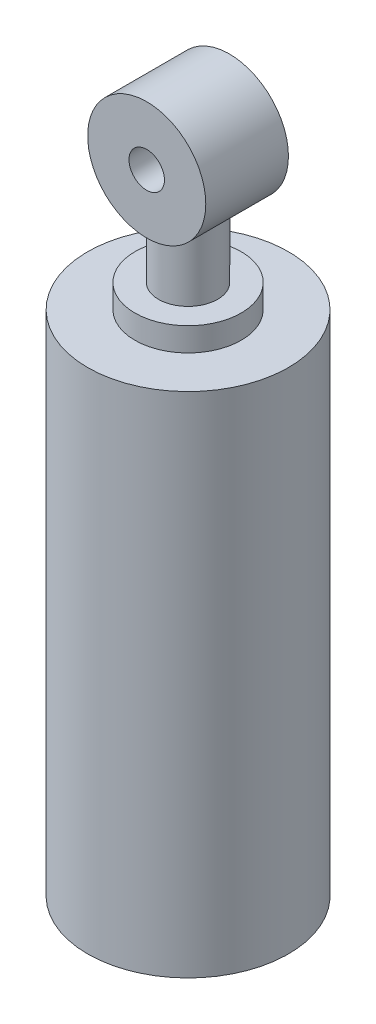
ISO-10303-21;
HEADER;
FILE_DESCRIPTION(('STEP AP214'),'2;1');
FILE_NAME('part.step','',(''),(''),'','','');
FILE_SCHEMA(('AUTOMOTIVE_DESIGN { 1 0 10303 214 1 1 1 1 }'));
ENDSEC;
DATA;
#1=APPLICATION_CONTEXT('core data for automotive mechanical design processes');
#2=APPLICATION_PROTOCOL_DEFINITION('international standard','automotive_design',2000,#1);
#3=PRODUCT_CONTEXT('',#1,'mechanical');
#4=PRODUCT('Part','Part','',(#3));
#5=PRODUCT_RELATED_PRODUCT_CATEGORY('part','',(#4));
#6=PRODUCT_DEFINITION_FORMATION('','',#4);
#7=PRODUCT_DEFINITION_CONTEXT('part definition',#1,'design');
#8=PRODUCT_DEFINITION('design','',#6,#7);
#9=PRODUCT_DEFINITION_SHAPE('','',#8);
#10=(LENGTH_UNIT() NAMED_UNIT(*) SI_UNIT(.MILLI.,.METRE.));
#11=(NAMED_UNIT(*) PLANE_ANGLE_UNIT() SI_UNIT($,.RADIAN.));
#12=(NAMED_UNIT(*) SI_UNIT($,.STERADIAN.) SOLID_ANGLE_UNIT());
#13=UNCERTAINTY_MEASURE_WITH_UNIT(LENGTH_MEASURE(1.E-05),#10,'distance_accuracy_value','');
#14=(GEOMETRIC_REPRESENTATION_CONTEXT(3) GLOBAL_UNCERTAINTY_ASSIGNED_CONTEXT((#13)) GLOBAL_UNIT_ASSIGNED_CONTEXT((#10,
#11,#12)) REPRESENTATION_CONTEXT('',''));
#15=CARTESIAN_POINT('',(0.,0.,0.));
#16=DIRECTION('',(0.,0.,1.));
#17=DIRECTION('',(1.,0.,0.));
#18=AXIS2_PLACEMENT_3D('',#15,#16,#17);
#19=CARTESIAN_POINT('',(0.,52.,0.));
#20=DIRECTION('',(0.,-1.,0.));
#21=DIRECTION('',(0.,0.,-1.));
#22=AXIS2_PLACEMENT_3D('',#19,#20,#21);
#23=CYLINDRICAL_SURFACE('',#22,2.5);
#24=CARTESIAN_POINT('',(0.,45.,0.));
#25=DIRECTION('',(0.,1.,0.));
#26=DIRECTION('',(0.,0.,1.));
#27=AXIS2_PLACEMENT_3D('',#24,#25,#26);
#28=CIRCLE('',#27,2.5);
#29=CARTESIAN_POINT('',(0.,45.,2.5));
#30=VERTEX_POINT('',#29);
#31=EDGE_CURVE('E92',#30,#30,#28,.T.);
#32=ORIENTED_EDGE('',*,*,#31,.T.);
#33=EDGE_LOOP('',(#32));
#34=FACE_BOUND('',#33,.T.);
#35=CARTESIAN_POINT('',(0.,50.,-2.5));
#36=CARTESIAN_POINT('',(-0.131426682334305,50.0000082244953,-2.49999033094399));
#37=CARTESIAN_POINT('',(-0.263015634437213,50.0052380086472,-2.48957443822597));
#38=CARTESIAN_POINT('',(-0.522301454622883,50.0256458143898,-2.44836817883795));
#39=CARTESIAN_POINT('',(-0.649990448564105,50.0408427281233,-2.41753911907498));
#40=CARTESIAN_POINT('',(-0.897333631316203,50.0795930907752,-2.33701537728116));
#41=CARTESIAN_POINT('',(-1.01701694536277,50.1031140409274,-2.28739401221727));
#42=CARTESIAN_POINT('',(-1.24618160399671,50.1563555667417,-2.1710734737482));
#43=CARTESIAN_POINT('',(-1.3556637520377,50.1860756535558,-2.10437564685491));
#44=CARTESIAN_POINT('',(-1.56876952630998,50.2510935494937,-1.95120686835737));
#45=CARTESIAN_POINT('',(-1.67163802294308,50.2866200234091,-1.86378379977022));
#46=CARTESIAN_POINT('',(-1.86194861703333,50.3585007422327,-1.67369630401471));
#47=CARTESIAN_POINT('',(-1.94937895911555,50.394855594331,-1.57102037115989));
#48=CARTESIAN_POINT('',(-2.11312999967247,50.4675262205438,-1.34379162555472));
#49=CARTESIAN_POINT('',(-2.18806333849064,50.5036203258743,-1.21815975396499));
#50=CARTESIAN_POINT('',(-2.31542056761491,50.5678505305644,-0.954081660204566));
#51=CARTESIAN_POINT('',(-2.36786053751682,50.5959923097921,-0.815644678237383));
#52=CARTESIAN_POINT('',(-2.44533110537653,50.638553324086,-0.538337236403588));
#53=CARTESIAN_POINT('',(-2.47181464267578,50.6536932104155,-0.399988869820418));
#54=CARTESIAN_POINT('',(-2.50106748329741,50.6704527512785,-0.120052905562391));
#55=CARTESIAN_POINT('',(-2.50386022093906,50.6720857664157,0.0215313521750944));
#56=CARTESIAN_POINT('',(-2.48671821792512,50.6622267435706,0.285715060790882));
#57=CARTESIAN_POINT('',(-2.46946139884055,50.6522809084502,0.408560078058287));
#58=CARTESIAN_POINT('',(-2.41734962264384,50.6230942816532,0.649304773431946));
#59=CARTESIAN_POINT('',(-2.38248905974454,50.6038505292055,0.767202863263111));
#60=CARTESIAN_POINT('',(-2.29552445096459,50.5578130896816,0.998072831414332));
#61=CARTESIAN_POINT('',(-2.24303766778987,50.5308539834001,1.11086599696452));
#62=CARTESIAN_POINT('',(-2.12260421917012,50.4724148929649,1.32658573147497));
#63=CARTESIAN_POINT('',(-2.0546506095312,50.4409328804952,1.42950783900021));
#64=CARTESIAN_POINT('',(-1.89516513728194,50.3721710524179,1.63630313185808));
#65=CARTESIAN_POINT('',(-1.8017361459232,50.3346622440813,1.7386421839404));
#66=CARTESIAN_POINT('',(-1.59888894685344,50.2613094174898,1.92683854647725));
#67=CARTESIAN_POINT('',(-1.48946314143571,50.22546620103,2.0126879800847));
#68=CARTESIAN_POINT('',(-1.25129126457962,50.1574503179259,2.16921415257432));
#69=CARTESIAN_POINT('',(-1.12188397899853,50.1255253959498,2.23900118111436));
#70=CARTESIAN_POINT('',(-0.851165538721986,50.0710529719689,2.35524257260752));
#71=CARTESIAN_POINT('',(-0.709863940663163,50.0484980264111,2.4017154625379));
#72=CARTESIAN_POINT('',(-0.431916229151781,50.0168916564642,2.4661885092917));
#73=CARTESIAN_POINT('',(-0.295853826370906,50.0068765424676,2.486228089367));
#74=CARTESIAN_POINT('',(-0.0219489998732885,49.9981746635221,2.50366182783617));
#75=CARTESIAN_POINT('',(0.115892549675109,49.9994825319657,2.5010667140985));
#76=CARTESIAN_POINT('',(0.378082429964656,50.0127201936653,2.4744832789533));
#77=CARTESIAN_POINT('',(0.502648520123706,50.0238188578001,2.4521686681756));
#78=CARTESIAN_POINT('',(0.746017230755972,50.0544457171247,2.38940482026162));
#79=CARTESIAN_POINT('',(0.864819214231884,50.0739748416237,2.3489535838641));
#80=CARTESIAN_POINT('',(1.09722152111965,50.1203937146767,2.25000383391964));
#81=CARTESIAN_POINT('',(1.21057599249831,50.1474779558213,2.19102237471768));
#82=CARTESIAN_POINT('',(1.42615340426439,50.2064006420025,2.05723116087518));
#83=CARTESIAN_POINT('',(1.52837157450204,50.2382411105947,1.98241466348012));
#84=CARTESIAN_POINT('',(1.72941922315487,50.3072944668491,1.81059893670911));
#85=CARTESIAN_POINT('',(1.82693019428496,50.3447278799051,1.7121428290248));
#86=CARTESIAN_POINT('',(2.0046408025722,50.4184402107841,1.50018712195056));
#87=CARTESIAN_POINT('',(2.08482846428685,50.4547183152759,1.38667720293013));
#88=CARTESIAN_POINT('',(2.22926978618995,50.5237201945472,1.14089086451535));
#89=CARTESIAN_POINT('',(2.29256373922243,50.5561867601875,1.00797183470886));
#90=CARTESIAN_POINT('',(2.39520706511459,50.6106481927325,0.731224831117449));
#91=CARTESIAN_POINT('',(2.43458729077055,50.6326565445099,0.58741118400001));
#92=CARTESIAN_POINT('',(2.48465421767005,50.6609624743065,0.307724442637057));
#93=CARTESIAN_POINT('',(2.4977324874436,50.668565413259,0.172414365881031));
#94=CARTESIAN_POINT('',(2.50172288950898,50.6708661340742,-0.0986176673806788));
#95=CARTESIAN_POINT('',(2.49264462983266,50.6655695097489,-0.234339419873629));
#96=CARTESIAN_POINT('',(2.45481530197332,50.6440534483534,-0.488708755616851));
#97=CARTESIAN_POINT('',(2.42802074302696,50.6289226366187,-0.607751181720766));
#98=CARTESIAN_POINT('',(2.35793843840543,50.590724596624,-0.839520292199955));
#99=CARTESIAN_POINT('',(2.31464538728732,50.5676548156503,-0.952244931566541));
#100=CARTESIAN_POINT('',(2.20953919315538,50.5142867356659,-1.17656215271973));
#101=CARTESIAN_POINT('',(2.14667719009403,50.4836069200155,-1.28756985173502));
#102=CARTESIAN_POINT('',(2.0053780838799,50.4191167292254,-1.49818624324005));
#103=CARTESIAN_POINT('',(1.92693287765888,50.3853047302923,-1.59778896262873));
#104=CARTESIAN_POINT('',(1.74550556946065,50.3134418367299,-1.79535536374964));
#105=CARTESIAN_POINT('',(1.6407002246921,50.2753750848502,-1.89164936417138));
#106=CARTESIAN_POINT('',(1.41539785420684,50.2030565261645,-2.06565584942804));
#107=CARTESIAN_POINT('',(1.29489242426332,50.1688067809455,-2.14335831860588));
#108=CARTESIAN_POINT('',(1.03978808878536,50.1075485054222,-2.2780969794841));
#109=CARTESIAN_POINT('',(0.905095560782288,50.0805928856251,-2.33498316778445));
#110=CARTESIAN_POINT('',(0.696328709257351,50.0482203907665,-2.4021838587924));
#111=CARTESIAN_POINT('',(0.625670413494088,50.0387768591813,-2.42155539800181));
#112=CARTESIAN_POINT('',(0.482623997839258,50.022828727249,-2.4540659483706));
#113=CARTESIAN_POINT('',(0.410236963092401,50.0163223317684,-2.46720876667635));
#114=CARTESIAN_POINT('',(0.28151868462167,50.0076179923387,-2.48473747228463));
#115=CARTESIAN_POINT('',(0.225408499555444,50.0047671153355,-2.49045493653132));
#116=CARTESIAN_POINT('',(0.112875528456288,50.0009563267034,-2.49808832946571));
#117=CARTESIAN_POINT('',(0.0564527338382178,49.999996467268,-2.50000415322548));
#118=CARTESIAN_POINT('',(0.,50.,-2.5));
#119=B_SPLINE_CURVE_WITH_KNOTS('',3,(#35,#36,#37,#38,#39,#40,#41,#42,#43,#44,#45,#46,#47,#48,
#49,#50,#51,#52,#53,#54,#55,#56,#57,#58,#59,#60,#61,#62,#63,#64,#65,#66,#67,#68,#69,#70,#71,#72,
#73,#74,#75,#76,#77,#78,#79,#80,#81,#82,#83,#84,#85,#86,#87,#88,#89,#90,#91,#92,#93,#94,#95,#96,
#97,#98,#99,#100,#101,#102,#103,#104,#105,#106,#107,#108,#109,#110,#111,#112,#113,#114,#115,
#116,#117,#118),.UNSPECIFIED.,.T.,.F.,(4,2,2,2,2,2,2,2,2,2,2,2,2,2,2,2,2,2,2,2,2,2,2,2,2,2,2,2,
2,2,2,2,2,2,2,2,2,2,2,2,2,4),(0.,0.394060643550731,0.788870374272994,1.18215538873075,
1.57540940145392,1.99245439679522,2.40981559413509,2.85954316076881,3.30894869745702,
3.73145030350574,4.15353393322551,4.52514281023301,4.89687009814196,5.27725600421218,
5.65781303150554,6.08662353334696,6.51563836496716,6.96457555536101,7.41315542280699,
7.82458226178364,8.2358141127869,8.61517266265305,8.99457304077329,9.38482140069747,
9.77523626870848,10.2039902661037,10.6330397153795,11.0828670540368,11.53211279863,
11.9382326875699,12.3441764966106,12.7114482562151,13.0788382197025,13.4709114195009,
13.8631890285845,14.303131068923,14.7433095845248,15.1866003415819,15.407934939208,
15.6291340766843,15.7983933645035,15.9676573239323),.UNSPECIFIED.);
#120=CARTESIAN_POINT('',(0.,50.,-2.5));
#121=VERTEX_POINT('',#120);
#122=EDGE_CURVE('E10',#121,#121,#119,.T.);
#123=ORIENTED_EDGE('',*,*,#122,.F.);
#124=EDGE_LOOP('',(#123));
#125=FACE_BOUND('',#124,.T.);
#126=ADVANCED_FACE('F34',(#34,#125),#23,.T.);
#127=CARTESIAN_POINT('',(0.,55.,3.5));
#128=DIRECTION('',(0.,0.,-1.));
#129=DIRECTION('',(-1.,0.,0.));
#130=AXIS2_PLACEMENT_3D('',#127,#128,#129);
#131=CYLINDRICAL_SURFACE('',#130,5.);
#132=CARTESIAN_POINT('',(0.,55.,-3.5));
#133=DIRECTION('',(0.,0.,1.));
#134=DIRECTION('',(1.,0.,0.));
#135=AXIS2_PLACEMENT_3D('',#132,#133,#134);
#136=CIRCLE('',#135,5.);
#137=CARTESIAN_POINT('',(5.,55.,-3.5));
#138=VERTEX_POINT('',#137);
#139=EDGE_CURVE('E106',#138,#138,#136,.T.);
#140=ORIENTED_EDGE('',*,*,#139,.T.);
#141=EDGE_LOOP('',(#140));
#142=FACE_BOUND('',#141,.T.);
#143=CARTESIAN_POINT('',(0.,55.,3.5));
#144=DIRECTION('',(0.,0.,1.));
#145=DIRECTION('',(1.,0.,0.));
#146=AXIS2_PLACEMENT_3D('',#143,#144,#145);
#147=CIRCLE('',#146,5.);
#148=CARTESIAN_POINT('',(5.,55.,3.5));
#149=VERTEX_POINT('',#148);
#150=EDGE_CURVE('E103',#149,#149,#147,.T.);
#151=ORIENTED_EDGE('',*,*,#150,.F.);
#152=EDGE_LOOP('',(#151));
#153=FACE_BOUND('',#152,.T.);
#154=ORIENTED_EDGE('',*,*,#122,.T.);
#155=EDGE_LOOP('',(#154));
#156=FACE_BOUND('',#155,.T.);
#157=ADVANCED_FACE('F56',(#142,#153,#156),#131,.T.);
#158=CARTESIAN_POINT('',(0.,55.,3.5));
#159=DIRECTION('',(0.,0.,1.));
#160=DIRECTION('',(1.,0.,0.));
#161=AXIS2_PLACEMENT_3D('',#158,#159,#160);
#162=PLANE('',#161);
#163=CARTESIAN_POINT('',(0.,55.,3.5));
#164=DIRECTION('',(0.,0.,1.));
#165=DIRECTION('',(1.,0.,0.));
#166=AXIS2_PLACEMENT_3D('',#163,#164,#165);
#167=CIRCLE('',#166,1.5);
#168=CARTESIAN_POINT('',(1.5,55.,3.5));
#169=VERTEX_POINT('',#168);
#170=EDGE_CURVE('E99',#169,#169,#167,.T.);
#171=ORIENTED_EDGE('',*,*,#170,.F.);
#172=EDGE_LOOP('',(#171));
#173=FACE_BOUND('',#172,.T.);
#174=ORIENTED_EDGE('',*,*,#150,.T.);
#175=EDGE_LOOP('',(#174));
#176=FACE_BOUND('',#175,.T.);
#177=ADVANCED_FACE('F60',(#173,#176),#162,.T.);
#178=CARTESIAN_POINT('',(0.,55.,-3.5));
#179=DIRECTION('',(0.,0.,1.));
#180=DIRECTION('',(1.,0.,0.));
#181=AXIS2_PLACEMENT_3D('',#178,#179,#180);
#182=PLANE('',#181);
#183=CARTESIAN_POINT('',(0.,55.,-3.5));
#184=DIRECTION('',(0.,0.,1.));
#185=DIRECTION('',(1.,0.,0.));
#186=AXIS2_PLACEMENT_3D('',#183,#184,#185);
#187=CIRCLE('',#186,1.5);
#188=CARTESIAN_POINT('',(1.5,55.,-3.5));
#189=VERTEX_POINT('',#188);
#190=EDGE_CURVE('E38',#189,#189,#187,.T.);
#191=ORIENTED_EDGE('',*,*,#190,.T.);
#192=EDGE_LOOP('',(#191));
#193=FACE_BOUND('',#192,.T.);
#194=ORIENTED_EDGE('',*,*,#139,.F.);
#195=EDGE_LOOP('',(#194));
#196=FACE_BOUND('',#195,.T.);
#197=ADVANCED_FACE('F62',(#193,#196),#182,.F.);
#198=CARTESIAN_POINT('',(0.,55.,-6.5));
#199=DIRECTION('',(0.,0.,1.));
#200=DIRECTION('',(1.,0.,0.));
#201=AXIS2_PLACEMENT_3D('',#198,#199,#200);
#202=CYLINDRICAL_SURFACE('',#201,1.5);
#203=ORIENTED_EDGE('',*,*,#170,.T.);
#204=EDGE_LOOP('',(#203));
#205=FACE_BOUND('',#204,.T.);
#206=ORIENTED_EDGE('',*,*,#190,.F.);
#207=EDGE_LOOP('',(#206));
#208=FACE_BOUND('',#207,.T.);
#209=ADVANCED_FACE('F65',(#205,#208),#202,.F.);
#210=CARTESIAN_POINT('',(0.,45.,0.));
#211=DIRECTION('',(0.,1.,0.));
#212=DIRECTION('',(0.,0.,1.));
#213=AXIS2_PLACEMENT_3D('',#210,#211,#212);
#214=PLANE('',#213);
#215=CARTESIAN_POINT('',(0.,45.,0.));
#216=DIRECTION('',(0.,1.,0.));
#217=DIRECTION('',(0.,0.,1.));
#218=AXIS2_PLACEMENT_3D('',#215,#216,#217);
#219=CIRCLE('',#218,4.5);
#220=CARTESIAN_POINT('',(0.,45.,4.5));
#221=VERTEX_POINT('',#220);
#222=EDGE_CURVE('E96',#221,#221,#219,.T.);
#223=ORIENTED_EDGE('',*,*,#222,.T.);
#224=EDGE_LOOP('',(#223));
#225=FACE_BOUND('',#224,.T.);
#226=ORIENTED_EDGE('',*,*,#31,.F.);
#227=EDGE_LOOP('',(#226));
#228=FACE_BOUND('',#227,.T.);
#229=ADVANCED_FACE('F72',(#225,#228),#214,.T.);
#230=CARTESIAN_POINT('',(0.,45.,0.));
#231=DIRECTION('',(0.,-1.,0.));
#232=DIRECTION('',(0.,0.,-1.));
#233=AXIS2_PLACEMENT_3D('',#230,#231,#232);
#234=CYLINDRICAL_SURFACE('',#233,4.5);
#235=ORIENTED_EDGE('',*,*,#222,.F.);
#236=EDGE_LOOP('',(#235));
#237=FACE_BOUND('',#236,.T.);
#238=CARTESIAN_POINT('',(0.,43.,0.));
#239=DIRECTION('',(0.,1.,0.));
#240=DIRECTION('',(0.,0.,1.));
#241=AXIS2_PLACEMENT_3D('',#238,#239,#240);
#242=CIRCLE('',#241,4.5);
#243=CARTESIAN_POINT('',(0.,43.,4.5));
#244=VERTEX_POINT('',#243);
#245=EDGE_CURVE('E93',#244,#244,#242,.T.);
#246=ORIENTED_EDGE('',*,*,#245,.T.);
#247=EDGE_LOOP('',(#246));
#248=FACE_BOUND('',#247,.T.);
#249=ADVANCED_FACE('F74',(#237,#248),#234,.T.);
#250=CARTESIAN_POINT('',(0.,0.,0.));
#251=DIRECTION('',(0.,1.,0.));
#252=DIRECTION('',(0.,0.,1.));
#253=AXIS2_PLACEMENT_3D('',#250,#251,#252);
#254=PLANE('',#253);
#255=CARTESIAN_POINT('',(0.,0.,0.));
#256=DIRECTION('',(0.,1.,0.));
#257=DIRECTION('',(0.,0.,1.));
#258=AXIS2_PLACEMENT_3D('',#255,#256,#257);
#259=CIRCLE('',#258,8.5);
#260=CARTESIAN_POINT('',(0.,0.,8.5));
#261=VERTEX_POINT('',#260);
#262=EDGE_CURVE('E46',#261,#261,#259,.T.);
#263=ORIENTED_EDGE('',*,*,#262,.F.);
#264=EDGE_LOOP('',(#263));
#265=FACE_BOUND('',#264,.T.);
#266=ADVANCED_FACE('F77',(#265),#254,.F.);
#267=CARTESIAN_POINT('',(0.,43.,0.));
#268=DIRECTION('',(0.,-1.,0.));
#269=DIRECTION('',(0.,0.,-1.));
#270=AXIS2_PLACEMENT_3D('',#267,#268,#269);
#271=CYLINDRICAL_SURFACE('',#270,8.5);
#272=CARTESIAN_POINT('',(0.,43.,0.));
#273=DIRECTION('',(0.,1.,0.));
#274=DIRECTION('',(0.,0.,1.));
#275=AXIS2_PLACEMENT_3D('',#272,#273,#274);
#276=CIRCLE('',#275,8.5);
#277=CARTESIAN_POINT('',(0.,43.,8.5));
#278=VERTEX_POINT('',#277);
#279=EDGE_CURVE('E42',#278,#278,#276,.T.);
#280=ORIENTED_EDGE('',*,*,#279,.F.);
#281=EDGE_LOOP('',(#280));
#282=FACE_BOUND('',#281,.T.);
#283=ORIENTED_EDGE('',*,*,#262,.T.);
#284=EDGE_LOOP('',(#283));
#285=FACE_BOUND('',#284,.T.);
#286=ADVANCED_FACE('F36',(#282,#285),#271,.T.);
#287=CARTESIAN_POINT('',(0.,43.,0.));
#288=DIRECTION('',(0.,1.,0.));
#289=DIRECTION('',(0.,0.,1.));
#290=AXIS2_PLACEMENT_3D('',#287,#288,#289);
#291=PLANE('',#290);
#292=ORIENTED_EDGE('',*,*,#279,.T.);
#293=EDGE_LOOP('',(#292));
#294=FACE_BOUND('',#293,.T.);
#295=ORIENTED_EDGE('',*,*,#245,.F.);
#296=EDGE_LOOP('',(#295));
#297=FACE_BOUND('',#296,.T.);
#298=ADVANCED_FACE('F124',(#294,#297),#291,.T.);
#299=CLOSED_SHELL('',(#126,#157,#177,#197,#209,#229,#249,#266,#286,#298));
#300=MANIFOLD_SOLID_BREP('B2',#299);
#301=ADVANCED_BREP_SHAPE_REPRESENTATION('',(#18,#300),#14);
#302=SHAPE_DEFINITION_REPRESENTATION(#9,#301);
ENDSEC;
END-ISO-10303-21;
